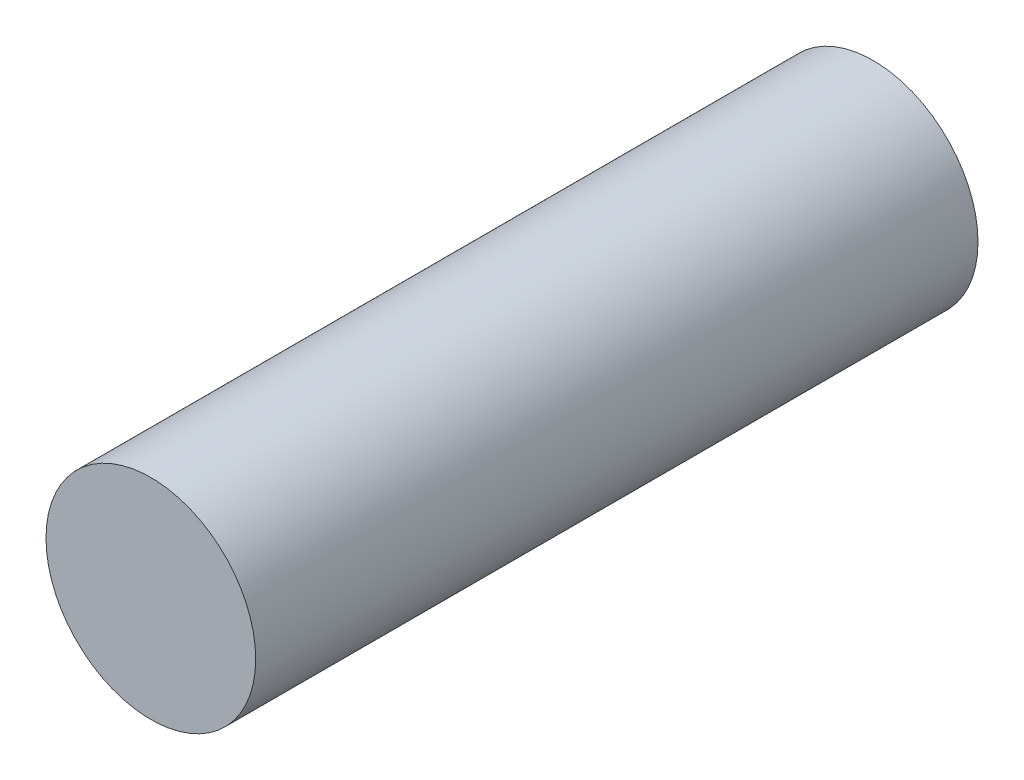
ISO-10303-21;
HEADER;
FILE_DESCRIPTION(('STEP AP214'),'2;1');
FILE_NAME('part.step','',(''),(''),'','','');
FILE_SCHEMA(('AUTOMOTIVE_DESIGN { 1 0 10303 214 1 1 1 1 }'));
ENDSEC;
DATA;
#1=APPLICATION_CONTEXT('core data for automotive mechanical design processes');
#2=APPLICATION_PROTOCOL_DEFINITION('international standard','automotive_design',2000,#1);
#3=PRODUCT_CONTEXT('',#1,'mechanical');
#4=PRODUCT('Part','Part','',(#3));
#5=PRODUCT_RELATED_PRODUCT_CATEGORY('part','',(#4));
#6=PRODUCT_DEFINITION_FORMATION('','',#4);
#7=PRODUCT_DEFINITION_CONTEXT('part definition',#1,'design');
#8=PRODUCT_DEFINITION('design','',#6,#7);
#9=PRODUCT_DEFINITION_SHAPE('','',#8);
#10=(LENGTH_UNIT() NAMED_UNIT(*) SI_UNIT(.MILLI.,.METRE.));
#11=(NAMED_UNIT(*) PLANE_ANGLE_UNIT() SI_UNIT($,.RADIAN.));
#12=(NAMED_UNIT(*) SI_UNIT($,.STERADIAN.) SOLID_ANGLE_UNIT());
#13=UNCERTAINTY_MEASURE_WITH_UNIT(LENGTH_MEASURE(1.E-05),#10,'distance_accuracy_value','');
#14=(GEOMETRIC_REPRESENTATION_CONTEXT(3) GLOBAL_UNCERTAINTY_ASSIGNED_CONTEXT((#13)) GLOBAL_UNIT_ASSIGNED_CONTEXT((#10,
#11,#12)) REPRESENTATION_CONTEXT('',''));
#15=CARTESIAN_POINT('',(0.,0.,0.));
#16=DIRECTION('',(0.,0.,1.));
#17=DIRECTION('',(1.,0.,0.));
#18=AXIS2_PLACEMENT_3D('',#15,#16,#17);
#19=CARTESIAN_POINT('',(-4.40965901623516,2.93216361537388,31.));
#20=DIRECTION('',(0.,0.,-1.));
#21=DIRECTION('',(-1.,0.,0.));
#22=AXIS2_PLACEMENT_3D('',#19,#20,#21);
#23=CYLINDRICAL_SURFACE('',#22,4.5);
#24=CARTESIAN_POINT('',(-4.40965901623516,2.93216361537388,31.));
#25=DIRECTION('',(0.,0.,1.));
#26=DIRECTION('',(1.,0.,0.));
#27=AXIS2_PLACEMENT_3D('',#24,#25,#26);
#28=CIRCLE('',#27,4.5);
#29=CARTESIAN_POINT('',(0.0903409837648365,2.93216361537388,31.));
#30=VERTEX_POINT('',#29);
#31=EDGE_CURVE('E10',#30,#30,#28,.T.);
#32=ORIENTED_EDGE('',*,*,#31,.F.);
#33=EDGE_LOOP('',(#32));
#34=FACE_BOUND('',#33,.T.);
#35=CARTESIAN_POINT('',(-4.40965901623516,2.93216361537388,0.));
#36=DIRECTION('',(0.,0.,1.));
#37=DIRECTION('',(1.,0.,0.));
#38=AXIS2_PLACEMENT_3D('',#35,#36,#37);
#39=CIRCLE('',#38,4.5);
#40=CARTESIAN_POINT('',(0.0903409837648365,2.93216361537388,0.));
#41=VERTEX_POINT('',#40);
#42=EDGE_CURVE('E34',#41,#41,#39,.T.);
#43=ORIENTED_EDGE('',*,*,#42,.T.);
#44=EDGE_LOOP('',(#43));
#45=FACE_BOUND('',#44,.T.);
#46=ADVANCED_FACE('F31',(#34,#45),#23,.T.);
#47=CARTESIAN_POINT('',(-4.40965901623516,2.93216361537388,31.));
#48=DIRECTION('',(0.,0.,1.));
#49=DIRECTION('',(1.,0.,0.));
#50=AXIS2_PLACEMENT_3D('',#47,#48,#49);
#51=PLANE('',#50);
#52=ORIENTED_EDGE('',*,*,#31,.T.);
#53=EDGE_LOOP('',(#52));
#54=FACE_BOUND('',#53,.T.);
#55=ADVANCED_FACE('F46',(#54),#51,.T.);
#56=CARTESIAN_POINT('',(-4.40965901623516,2.93216361537388,0.));
#57=DIRECTION('',(0.,0.,1.));
#58=DIRECTION('',(1.,0.,0.));
#59=AXIS2_PLACEMENT_3D('',#56,#57,#58);
#60=PLANE('',#59);
#61=ORIENTED_EDGE('',*,*,#42,.F.);
#62=EDGE_LOOP('',(#61));
#63=FACE_BOUND('',#62,.T.);
#64=ADVANCED_FACE('F44',(#63),#60,.F.);
#65=CLOSED_SHELL('',(#46,#55,#64));
#66=MANIFOLD_SOLID_BREP('B2',#65);
#67=ADVANCED_BREP_SHAPE_REPRESENTATION('',(#18,#66),#14);
#68=SHAPE_DEFINITION_REPRESENTATION(#9,#67);
ENDSEC;
END-ISO-10303-21;
